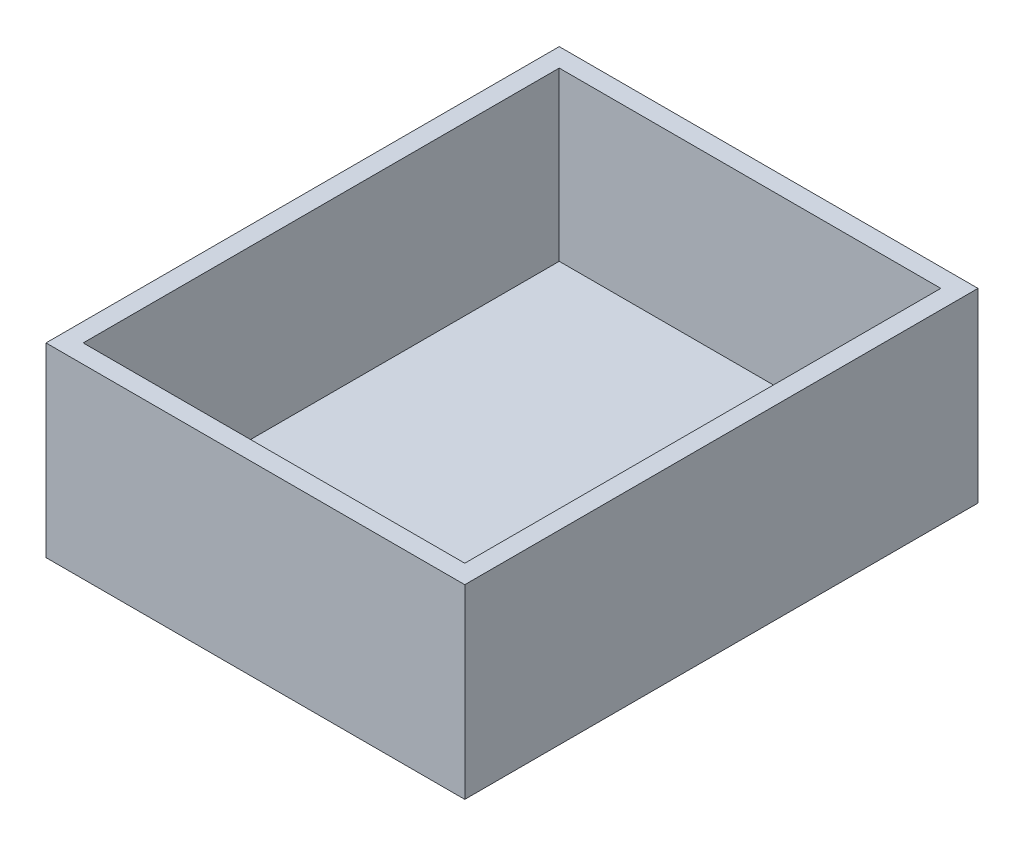
ISO-10303-21;
HEADER;
FILE_DESCRIPTION(('STEP AP214'),'2;1');
FILE_NAME('part.step','',(''),(''),'','','');
FILE_SCHEMA(('AUTOMOTIVE_DESIGN { 1 0 10303 214 1 1 1 1 }'));
ENDSEC;
DATA;
#1=APPLICATION_CONTEXT('core data for automotive mechanical design processes');
#2=APPLICATION_PROTOCOL_DEFINITION('international standard','automotive_design',2000,#1);
#3=PRODUCT_CONTEXT('',#1,'mechanical');
#4=PRODUCT('Part','Part','',(#3));
#5=PRODUCT_RELATED_PRODUCT_CATEGORY('part','',(#4));
#6=PRODUCT_DEFINITION_FORMATION('','',#4);
#7=PRODUCT_DEFINITION_CONTEXT('part definition',#1,'design');
#8=PRODUCT_DEFINITION('design','',#6,#7);
#9=PRODUCT_DEFINITION_SHAPE('','',#8);
#10=(LENGTH_UNIT() NAMED_UNIT(*) SI_UNIT(.MILLI.,.METRE.));
#11=(NAMED_UNIT(*) PLANE_ANGLE_UNIT() SI_UNIT($,.RADIAN.));
#12=(NAMED_UNIT(*) SI_UNIT($,.STERADIAN.) SOLID_ANGLE_UNIT());
#13=UNCERTAINTY_MEASURE_WITH_UNIT(LENGTH_MEASURE(1.E-05),#10,'distance_accuracy_value','');
#14=(GEOMETRIC_REPRESENTATION_CONTEXT(3) GLOBAL_UNCERTAINTY_ASSIGNED_CONTEXT((#13)) GLOBAL_UNIT_ASSIGNED_CONTEXT((#10,
#11,#12)) REPRESENTATION_CONTEXT('',''));
#15=CARTESIAN_POINT('',(0.,0.,0.));
#16=DIRECTION('',(0.,0.,1.));
#17=DIRECTION('',(1.,0.,0.));
#18=AXIS2_PLACEMENT_3D('',#15,#16,#17);
#19=CARTESIAN_POINT('',(0.,0.,0.));
#20=DIRECTION('',(0.,1.,0.));
#21=DIRECTION('',(0.,0.,1.));
#22=AXIS2_PLACEMENT_3D('',#19,#20,#21);
#23=PLANE('',#22);
#24=DIRECTION('',(-1.,0.,0.));
#25=VECTOR('',#24,1.);
#26=CARTESIAN_POINT('',(65.7206077646098,0.,49.0477446669391));
#27=LINE('',#26,#25);
#28=CARTESIAN_POINT('',(65.7206077646098,0.,49.0477446669391));
#29=VERTEX_POINT('',#28);
#30=CARTESIAN_POINT('',(-46.8793922353902,0.,49.0477446669391));
#31=VERTEX_POINT('',#30);
#32=EDGE_CURVE('E148',#29,#31,#27,.T.);
#33=ORIENTED_EDGE('',*,*,#32,.T.);
#34=DIRECTION('',(0.,0.,1.));
#35=VECTOR('',#34,1.);
#36=CARTESIAN_POINT('',(-46.8793922353902,0.,-88.9522553330609));
#37=LINE('',#36,#35);
#38=CARTESIAN_POINT('',(-46.8793922353902,0.,-88.9522553330609));
#39=VERTEX_POINT('',#38);
#40=EDGE_CURVE('E166',#39,#31,#37,.T.);
#41=ORIENTED_EDGE('',*,*,#40,.F.);
#42=DIRECTION('',(-1.,0.,0.));
#43=VECTOR('',#42,1.);
#44=CARTESIAN_POINT('',(65.7206077646098,0.,-88.9522553330609));
#45=LINE('',#44,#43);
#46=CARTESIAN_POINT('',(65.7206077646098,0.,-88.9522553330609));
#47=VERTEX_POINT('',#46);
#48=EDGE_CURVE('E169',#47,#39,#45,.T.);
#49=ORIENTED_EDGE('',*,*,#48,.F.);
#50=DIRECTION('',(0.,0.,1.));
#51=VECTOR('',#50,1.);
#52=CARTESIAN_POINT('',(65.7206077646098,0.,-88.9522553330609));
#53=LINE('',#52,#51);
#54=EDGE_CURVE('E156',#47,#29,#53,.T.);
#55=ORIENTED_EDGE('',*,*,#54,.T.);
#56=EDGE_LOOP('',(#33,#41,#49,#55));
#57=FACE_BOUND('',#56,.T.);
#58=ADVANCED_FACE('F57',(#57),#23,.F.);
#59=CARTESIAN_POINT('',(65.7206077646098,50.,49.0477446669391));
#60=DIRECTION('',(0.,0.,1.));
#61=DIRECTION('',(1.,0.,0.));
#62=AXIS2_PLACEMENT_3D('',#59,#60,#61);
#63=PLANE('',#62);
#64=ORIENTED_EDGE('',*,*,#32,.F.);
#65=DIRECTION('',(0.,-1.,0.));
#66=VECTOR('',#65,1.);
#67=CARTESIAN_POINT('',(65.7206077646098,50.,49.0477446669391));
#68=LINE('',#67,#66);
#69=CARTESIAN_POINT('',(65.7206077646098,50.,49.0477446669391));
#70=VERTEX_POINT('',#69);
#71=EDGE_CURVE('E173',#70,#29,#68,.T.);
#72=ORIENTED_EDGE('',*,*,#71,.F.);
#73=DIRECTION('',(-1.,0.,0.));
#74=VECTOR('',#73,1.);
#75=CARTESIAN_POINT('',(65.7206077646098,50.,49.0477446669391));
#76=LINE('',#75,#74);
#77=CARTESIAN_POINT('',(-46.8793922353902,50.,49.0477446669391));
#78=VERTEX_POINT('',#77);
#79=EDGE_CURVE('E152',#70,#78,#76,.T.);
#80=ORIENTED_EDGE('',*,*,#79,.T.);
#81=DIRECTION('',(0.,-1.,0.));
#82=VECTOR('',#81,1.);
#83=CARTESIAN_POINT('',(-46.8793922353902,50.,49.0477446669391));
#84=LINE('',#83,#82);
#85=EDGE_CURVE('E163',#78,#31,#84,.T.);
#86=ORIENTED_EDGE('',*,*,#85,.T.);
#87=EDGE_LOOP('',(#64,#72,#80,#86));
#88=FACE_BOUND('',#87,.T.);
#89=ADVANCED_FACE('F197',(#88),#63,.T.);
#90=CARTESIAN_POINT('',(65.7206077646098,50.,-88.9522553330609));
#91=DIRECTION('',(1.,0.,0.));
#92=DIRECTION('',(0.,0.,-1.));
#93=AXIS2_PLACEMENT_3D('',#90,#91,#92);
#94=PLANE('',#93);
#95=ORIENTED_EDGE('',*,*,#54,.F.);
#96=DIRECTION('',(0.,-1.,0.));
#97=VECTOR('',#96,1.);
#98=CARTESIAN_POINT('',(65.7206077646098,50.,-88.9522553330609));
#99=LINE('',#98,#97);
#100=CARTESIAN_POINT('',(65.7206077646098,50.,-88.9522553330609));
#101=VERTEX_POINT('',#100);
#102=EDGE_CURVE('E176',#101,#47,#99,.T.);
#103=ORIENTED_EDGE('',*,*,#102,.F.);
#104=DIRECTION('',(0.,0.,1.));
#105=VECTOR('',#104,1.);
#106=CARTESIAN_POINT('',(65.7206077646098,50.,-88.9522553330609));
#107=LINE('',#106,#105);
#108=EDGE_CURVE('E160',#101,#70,#107,.T.);
#109=ORIENTED_EDGE('',*,*,#108,.T.);
#110=ORIENTED_EDGE('',*,*,#71,.T.);
#111=EDGE_LOOP('',(#95,#103,#109,#110));
#112=FACE_BOUND('',#111,.T.);
#113=ADVANCED_FACE('F202',(#112),#94,.T.);
#114=CARTESIAN_POINT('',(65.7206077646098,50.,-88.9522553330609));
#115=DIRECTION('',(0.,0.,1.));
#116=DIRECTION('',(1.,0.,0.));
#117=AXIS2_PLACEMENT_3D('',#114,#115,#116);
#118=PLANE('',#117);
#119=ORIENTED_EDGE('',*,*,#48,.T.);
#120=DIRECTION('',(0.,-1.,0.));
#121=VECTOR('',#120,1.);
#122=CARTESIAN_POINT('',(-46.8793922353902,50.,-88.9522553330609));
#123=LINE('',#122,#121);
#124=CARTESIAN_POINT('',(-46.8793922353902,50.,-88.9522553330609));
#125=VERTEX_POINT('',#124);
#126=EDGE_CURVE('E178',#125,#39,#123,.T.);
#127=ORIENTED_EDGE('',*,*,#126,.F.);
#128=DIRECTION('',(-1.,0.,0.));
#129=VECTOR('',#128,1.);
#130=CARTESIAN_POINT('',(65.7206077646098,50.,-88.9522553330609));
#131=LINE('',#130,#129);
#132=EDGE_CURVE('E158',#101,#125,#131,.T.);
#133=ORIENTED_EDGE('',*,*,#132,.F.);
#134=ORIENTED_EDGE('',*,*,#102,.T.);
#135=EDGE_LOOP('',(#119,#127,#133,#134));
#136=FACE_BOUND('',#135,.T.);
#137=ADVANCED_FACE('F217',(#136),#118,.F.);
#138=CARTESIAN_POINT('',(-46.8793922353902,50.,-88.9522553330609));
#139=DIRECTION('',(1.,0.,0.));
#140=DIRECTION('',(0.,0.,-1.));
#141=AXIS2_PLACEMENT_3D('',#138,#139,#140);
#142=PLANE('',#141);
#143=ORIENTED_EDGE('',*,*,#40,.T.);
#144=ORIENTED_EDGE('',*,*,#85,.F.);
#145=DIRECTION('',(0.,0.,1.));
#146=VECTOR('',#145,1.);
#147=CARTESIAN_POINT('',(-46.8793922353902,50.,-88.9522553330609));
#148=LINE('',#147,#146);
#149=EDGE_CURVE('E155',#125,#78,#148,.T.);
#150=ORIENTED_EDGE('',*,*,#149,.F.);
#151=ORIENTED_EDGE('',*,*,#126,.T.);
#152=EDGE_LOOP('',(#143,#144,#150,#151));
#153=FACE_BOUND('',#152,.T.);
#154=ADVANCED_FACE('F213',(#153),#142,.F.);
#155=CARTESIAN_POINT('',(0.,50.,0.));
#156=DIRECTION('',(0.,1.,0.));
#157=DIRECTION('',(0.,0.,1.));
#158=AXIS2_PLACEMENT_3D('',#155,#156,#157);
#159=PLANE('',#158);
#160=DIRECTION('',(-1.,0.,0.));
#161=VECTOR('',#160,1.);
#162=CARTESIAN_POINT('',(60.7206077646097,50.,44.0477446669391));
#163=LINE('',#162,#161);
#164=CARTESIAN_POINT('',(60.7206077646097,50.,44.0477446669391));
#165=VERTEX_POINT('',#164);
#166=CARTESIAN_POINT('',(-41.8793922353902,50.,44.0477446669391));
#167=VERTEX_POINT('',#166);
#168=EDGE_CURVE('E128',#165,#167,#163,.T.);
#169=ORIENTED_EDGE('',*,*,#168,.T.);
#170=DIRECTION('',(0.,0.,1.));
#171=VECTOR('',#170,1.);
#172=CARTESIAN_POINT('',(-41.8793922353902,50.,-83.9522553330609));
#173=LINE('',#172,#171);
#174=CARTESIAN_POINT('',(-41.8793922353902,50.,-83.9522553330609));
#175=VERTEX_POINT('',#174);
#176=EDGE_CURVE('E119',#175,#167,#173,.T.);
#177=ORIENTED_EDGE('',*,*,#176,.F.);
#178=DIRECTION('',(-1.,0.,0.));
#179=VECTOR('',#178,1.);
#180=CARTESIAN_POINT('',(60.7206077646097,50.,-83.9522553330609));
#181=LINE('',#180,#179);
#182=CARTESIAN_POINT('',(60.7206077646097,50.,-83.9522553330609));
#183=VERTEX_POINT('',#182);
#184=EDGE_CURVE('E127',#183,#175,#181,.T.);
#185=ORIENTED_EDGE('',*,*,#184,.F.);
#186=DIRECTION('',(0.,0.,1.));
#187=VECTOR('',#186,1.);
#188=CARTESIAN_POINT('',(60.7206077646097,50.,-83.9522553330609));
#189=LINE('',#188,#187);
#190=EDGE_CURVE('E137',#183,#165,#189,.T.);
#191=ORIENTED_EDGE('',*,*,#190,.T.);
#192=EDGE_LOOP('',(#169,#177,#185,#191));
#193=FACE_BOUND('',#192,.T.);
#194=ORIENTED_EDGE('',*,*,#79,.F.);
#195=ORIENTED_EDGE('',*,*,#108,.F.);
#196=ORIENTED_EDGE('',*,*,#132,.T.);
#197=ORIENTED_EDGE('',*,*,#149,.T.);
#198=EDGE_LOOP('',(#194,#195,#196,#197));
#199=FACE_BOUND('',#198,.T.);
#200=ADVANCED_FACE('F139',(#193,#199),#159,.T.);
#201=CARTESIAN_POINT('',(60.7206077646097,50.,44.0477446669391));
#202=DIRECTION('',(0.,0.,1.));
#203=DIRECTION('',(1.,0.,0.));
#204=AXIS2_PLACEMENT_3D('',#201,#202,#203);
#205=PLANE('',#204);
#206=DIRECTION('',(1.,0.,0.));
#207=VECTOR('',#206,1.);
#208=CARTESIAN_POINT('',(60.7206077646097,5.,44.0477446669391));
#209=LINE('',#208,#207);
#210=CARTESIAN_POINT('',(-41.8793922353903,5.,44.0477446669391));
#211=VERTEX_POINT('',#210);
#212=CARTESIAN_POINT('',(60.7206077646097,5.,44.0477446669391));
#213=VERTEX_POINT('',#212);
#214=EDGE_CURVE('E135',#211,#213,#209,.T.);
#215=ORIENTED_EDGE('',*,*,#214,.F.);
#216=DIRECTION('',(0.,-1.,0.));
#217=VECTOR('',#216,1.);
#218=CARTESIAN_POINT('',(-41.8793922353902,50.,44.0477446669391));
#219=LINE('',#218,#217);
#220=EDGE_CURVE('E71',#167,#211,#219,.T.);
#221=ORIENTED_EDGE('',*,*,#220,.F.);
#222=ORIENTED_EDGE('',*,*,#168,.F.);
#223=DIRECTION('',(0.,-1.,0.));
#224=VECTOR('',#223,1.);
#225=CARTESIAN_POINT('',(60.7206077646097,50.,44.0477446669391));
#226=LINE('',#225,#224);
#227=EDGE_CURVE('E146',#165,#213,#226,.T.);
#228=ORIENTED_EDGE('',*,*,#227,.T.);
#229=EDGE_LOOP('',(#215,#221,#222,#228));
#230=FACE_BOUND('',#229,.T.);
#231=ADVANCED_FACE('F132',(#230),#205,.F.);
#232=CARTESIAN_POINT('',(60.7206077646097,50.,-83.9522553330609));
#233=DIRECTION('',(1.,0.,0.));
#234=DIRECTION('',(0.,0.,-1.));
#235=AXIS2_PLACEMENT_3D('',#232,#233,#234);
#236=PLANE('',#235);
#237=DIRECTION('',(0.,0.,-1.));
#238=VECTOR('',#237,1.);
#239=CARTESIAN_POINT('',(60.7206077646097,5.,44.0477446669391));
#240=LINE('',#239,#238);
#241=CARTESIAN_POINT('',(60.7206077646097,5.,-83.9522553330609));
#242=VERTEX_POINT('',#241);
#243=EDGE_CURVE('E64',#213,#242,#240,.T.);
#244=ORIENTED_EDGE('',*,*,#243,.F.);
#245=ORIENTED_EDGE('',*,*,#227,.F.);
#246=ORIENTED_EDGE('',*,*,#190,.F.);
#247=DIRECTION('',(0.,-1.,0.));
#248=VECTOR('',#247,1.);
#249=CARTESIAN_POINT('',(60.7206077646097,50.,-83.9522553330609));
#250=LINE('',#249,#248);
#251=EDGE_CURVE('E149',#183,#242,#250,.T.);
#252=ORIENTED_EDGE('',*,*,#251,.T.);
#253=EDGE_LOOP('',(#244,#245,#246,#252));
#254=FACE_BOUND('',#253,.T.);
#255=ADVANCED_FACE('F187',(#254),#236,.F.);
#256=CARTESIAN_POINT('',(60.7206077646097,50.,-83.9522553330609));
#257=DIRECTION('',(0.,0.,1.));
#258=DIRECTION('',(1.,0.,0.));
#259=AXIS2_PLACEMENT_3D('',#256,#257,#258);
#260=PLANE('',#259);
#261=DIRECTION('',(0.,-1.,0.));
#262=VECTOR('',#261,1.);
#263=CARTESIAN_POINT('',(-41.8793922353902,50.,-83.9522553330609));
#264=LINE('',#263,#262);
#265=CARTESIAN_POINT('',(-41.8793922353902,5.,-83.9522553330609));
#266=VERTEX_POINT('',#265);
#267=EDGE_CURVE('E122',#175,#266,#264,.T.);
#268=ORIENTED_EDGE('',*,*,#267,.T.);
#269=DIRECTION('',(-1.,0.,0.));
#270=VECTOR('',#269,1.);
#271=CARTESIAN_POINT('',(60.7206077646097,5.,-83.9522553330609));
#272=LINE('',#271,#270);
#273=EDGE_CURVE('E12',#242,#266,#272,.T.);
#274=ORIENTED_EDGE('',*,*,#273,.F.);
#275=ORIENTED_EDGE('',*,*,#251,.F.);
#276=ORIENTED_EDGE('',*,*,#184,.T.);
#277=EDGE_LOOP('',(#268,#274,#275,#276));
#278=FACE_BOUND('',#277,.T.);
#279=ADVANCED_FACE('F186',(#278),#260,.T.);
#280=CARTESIAN_POINT('',(-41.8793922353902,50.,-83.9522553330609));
#281=DIRECTION('',(1.,0.,0.));
#282=DIRECTION('',(0.,0.,-1.));
#283=AXIS2_PLACEMENT_3D('',#280,#281,#282);
#284=PLANE('',#283);
#285=ORIENTED_EDGE('',*,*,#220,.T.);
#286=DIRECTION('',(0.,0.,1.));
#287=VECTOR('',#286,1.);
#288=CARTESIAN_POINT('',(-41.8793922353903,5.,44.0477446669391));
#289=LINE('',#288,#287);
#290=EDGE_CURVE('E175',#266,#211,#289,.T.);
#291=ORIENTED_EDGE('',*,*,#290,.F.);
#292=ORIENTED_EDGE('',*,*,#267,.F.);
#293=ORIENTED_EDGE('',*,*,#176,.T.);
#294=EDGE_LOOP('',(#285,#291,#292,#293));
#295=FACE_BOUND('',#294,.T.);
#296=ADVANCED_FACE('F120',(#295),#284,.T.);
#297=CARTESIAN_POINT('',(0.,5.,0.));
#298=DIRECTION('',(0.,1.,0.));
#299=DIRECTION('',(0.,0.,1.));
#300=AXIS2_PLACEMENT_3D('',#297,#298,#299);
#301=PLANE('',#300);
#302=ORIENTED_EDGE('',*,*,#290,.T.);
#303=ORIENTED_EDGE('',*,*,#214,.T.);
#304=ORIENTED_EDGE('',*,*,#243,.T.);
#305=ORIENTED_EDGE('',*,*,#273,.T.);
#306=EDGE_LOOP('',(#302,#303,#304,#305));
#307=FACE_BOUND('',#306,.T.);
#308=ADVANCED_FACE('F184',(#307),#301,.T.);
#309=CLOSED_SHELL('',(#58,#89,#113,#137,#154,#200,#231,#255,#279,#296,#308));
#310=MANIFOLD_SOLID_BREP('B2',#309);
#311=ADVANCED_BREP_SHAPE_REPRESENTATION('',(#18,#310),#14);
#312=SHAPE_DEFINITION_REPRESENTATION(#9,#311);
ENDSEC;
END-ISO-10303-21;
